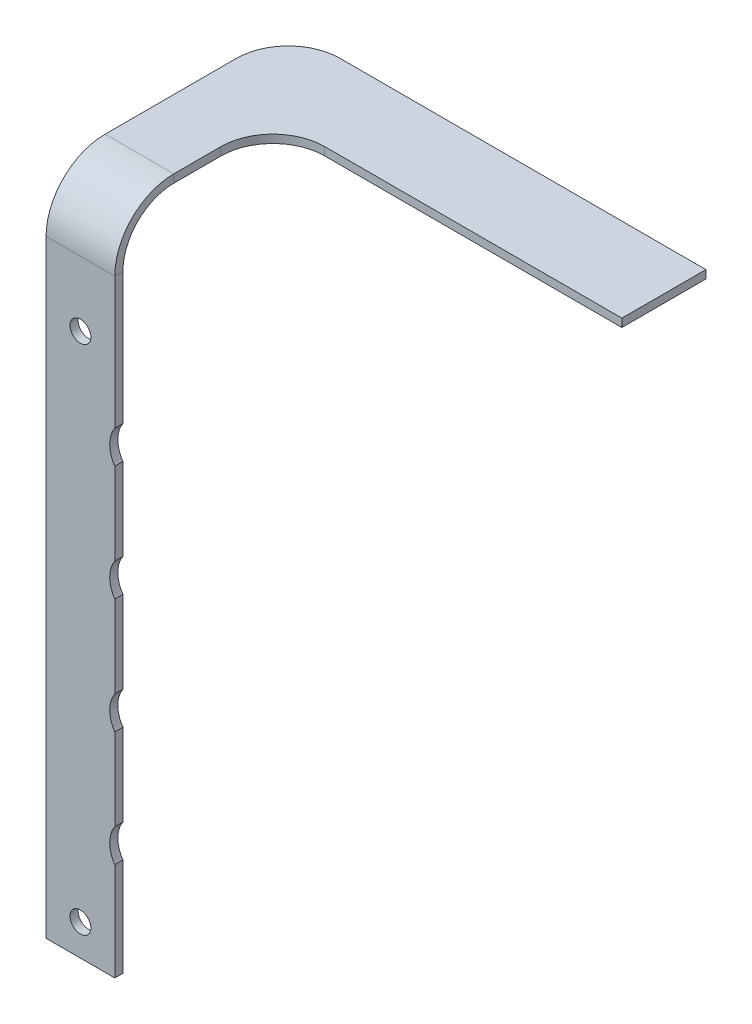
ISO-10303-21;
HEADER;
FILE_DESCRIPTION(('STEP AP214'),'2;1');
FILE_NAME('part.step','',(''),(''),'','','');
FILE_SCHEMA(('AUTOMOTIVE_DESIGN { 1 0 10303 214 1 1 1 1 }'));
ENDSEC;
DATA;
#1=APPLICATION_CONTEXT('core data for automotive mechanical design processes');
#2=APPLICATION_PROTOCOL_DEFINITION('international standard','automotive_design',2000,#1);
#3=PRODUCT_CONTEXT('',#1,'mechanical');
#4=PRODUCT('Part','Part','',(#3));
#5=PRODUCT_RELATED_PRODUCT_CATEGORY('part','',(#4));
#6=PRODUCT_DEFINITION_FORMATION('','',#4);
#7=PRODUCT_DEFINITION_CONTEXT('part definition',#1,'design');
#8=PRODUCT_DEFINITION('design','',#6,#7);
#9=PRODUCT_DEFINITION_SHAPE('','',#8);
#10=(LENGTH_UNIT() NAMED_UNIT(*) SI_UNIT(.MILLI.,.METRE.));
#11=(NAMED_UNIT(*) PLANE_ANGLE_UNIT() SI_UNIT($,.RADIAN.));
#12=(NAMED_UNIT(*) SI_UNIT($,.STERADIAN.) SOLID_ANGLE_UNIT());
#13=UNCERTAINTY_MEASURE_WITH_UNIT(LENGTH_MEASURE(1.E-05),#10,'distance_accuracy_value','');
#14=(GEOMETRIC_REPRESENTATION_CONTEXT(3) GLOBAL_UNCERTAINTY_ASSIGNED_CONTEXT((#13)) GLOBAL_UNIT_ASSIGNED_CONTEXT((#10,
#11,#12)) REPRESENTATION_CONTEXT('',''));
#15=CARTESIAN_POINT('',(0.,0.,0.));
#16=DIRECTION('',(0.,0.,1.));
#17=DIRECTION('',(1.,0.,0.));
#18=AXIS2_PLACEMENT_3D('',#15,#16,#17);
#19=CARTESIAN_POINT('',(-183.376451986279,68.2542114421701,1.5));
#20=DIRECTION('',(-1.,0.,0.));
#21=DIRECTION('',(0.,-1.,0.));
#22=AXIS2_PLACEMENT_3D('',#19,#20,#21);
#23=PLANE('',#22);
#24=DIRECTION('',(0.,1.,0.));
#25=VECTOR('',#24,1.);
#26=CARTESIAN_POINT('',(-183.376451986279,27.5283044221648,-0.100000102));
#27=LINE('',#26,#25);
#28=CARTESIAN_POINT('',(-183.376451986279,56.6542113401701,-0.100000101999995));
#29=VERTEX_POINT('',#28);
#30=CARTESIAN_POINT('',(-183.376451986279,30.7532075774239,-0.100000102));
#31=VERTEX_POINT('',#30);
#32=EDGE_CURVE('E314',#29,#31,#27,.F.);
#33=ORIENTED_EDGE('',*,*,#32,.F.);
#34=DIRECTION('',(0.,0.,1.));
#35=VECTOR('',#34,1.);
#36=CARTESIAN_POINT('',(-183.376451986279,56.6542113401701,-0.100000101999995));
#37=LINE('',#36,#35);
#38=CARTESIAN_POINT('',(-183.376451986279,56.6542113401701,1.5));
#39=VERTEX_POINT('',#38);
#40=EDGE_CURVE('E400',#29,#39,#37,.T.);
#41=ORIENTED_EDGE('',*,*,#40,.T.);
#42=DIRECTION('',(0.,-1.,0.));
#43=VECTOR('',#42,1.);
#44=CARTESIAN_POINT('',(-183.376451986279,68.2542114421701,1.5));
#45=LINE('',#44,#43);
#46=CARTESIAN_POINT('',(-183.376451986279,30.7532075774239,1.5));
#47=VERTEX_POINT('',#46);
#48=EDGE_CURVE('E187',#39,#47,#45,.T.);
#49=ORIENTED_EDGE('',*,*,#48,.T.);
#50=DIRECTION('',(0.,0.,1.));
#51=VECTOR('',#50,1.);
#52=CARTESIAN_POINT('',(-183.376451986279,30.7532075774239,1.5));
#53=LINE('',#52,#51);
#54=EDGE_CURVE('E342',#31,#47,#53,.T.);
#55=ORIENTED_EDGE('',*,*,#54,.F.);
#56=EDGE_LOOP('',(#33,#41,#49,#55));
#57=FACE_BOUND('',#56,.T.);
#58=ADVANCED_FACE('F162',(#57),#23,.F.);
#59=CARTESIAN_POINT('',(-178.676451988279,27.5283044221648,1.5));
#60=DIRECTION('',(0.,0.,1.));
#61=DIRECTION('',(1.,0.,0.));
#62=AXIS2_PLACEMENT_3D('',#59,#60,#61);
#63=PLANE('',#62);
#64=CARTESIAN_POINT('',(-190.126451986279,43.8957045041648,1.5));
#65=DIRECTION('',(0.,0.,1.));
#66=DIRECTION('',(1.,0.,0.));
#67=AXIS2_PLACEMENT_3D('',#64,#65,#66);
#68=CIRCLE('',#67,2.04470000000001);
#69=CARTESIAN_POINT('',(-188.081751986279,43.8957045041648,1.5));
#70=VERTEX_POINT('',#69);
#71=EDGE_CURVE('E341',#70,#70,#68,.T.);
#72=ORIENTED_EDGE('',*,*,#71,.F.);
#73=EDGE_LOOP('',(#72));
#74=FACE_BOUND('',#73,.T.);
#75=CARTESIAN_POINT('',(-190.126451986279,-56.6570956598352,1.5));
#76=DIRECTION('',(0.,0.,1.));
#77=DIRECTION('',(1.,0.,0.));
#78=AXIS2_PLACEMENT_3D('',#75,#76,#77);
#79=CIRCLE('',#78,2.04470000000001);
#80=CARTESIAN_POINT('',(-188.081751986279,-56.6570956598352,1.5));
#81=VERTEX_POINT('',#80);
#82=EDGE_CURVE('E303',#81,#81,#79,.T.);
#83=ORIENTED_EDGE('',*,*,#82,.F.);
#84=EDGE_LOOP('',(#83));
#85=FACE_BOUND('',#84,.T.);
#86=ORIENTED_EDGE('',*,*,#48,.F.);
#87=DIRECTION('',(1.,0.,0.));
#88=VECTOR('',#87,1.);
#89=CARTESIAN_POINT('',(-183.376451986279,56.6542113401701,1.5));
#90=LINE('',#89,#88);
#91=CARTESIAN_POINT('',(-196.876451986279,56.6542113401701,1.5));
#92=VERTEX_POINT('',#91);
#93=EDGE_CURVE('E233',#39,#92,#90,.F.);
#94=ORIENTED_EDGE('',*,*,#93,.T.);
#95=DIRECTION('',(0.,1.,0.));
#96=VECTOR('',#95,1.);
#97=CARTESIAN_POINT('',(-196.876451986279,-62.8005416878299,1.5));
#98=LINE('',#97,#96);
#99=CARTESIAN_POINT('',(-196.876451986279,-62.8005416878299,1.5));
#100=VERTEX_POINT('',#99);
#101=EDGE_CURVE('E389',#100,#92,#98,.T.);
#102=ORIENTED_EDGE('',*,*,#101,.F.);
#103=DIRECTION('',(-1.,0.,0.));
#104=VECTOR('',#103,1.);
#105=CARTESIAN_POINT('',(-183.376451986279,-62.8005416878299,1.5));
#106=LINE('',#105,#104);
#107=CARTESIAN_POINT('',(-183.376451986279,-62.8005416878299,1.5));
#108=VERTEX_POINT('',#107);
#109=EDGE_CURVE('E367',#108,#100,#106,.T.);
#110=ORIENTED_EDGE('',*,*,#109,.F.);
#111=DIRECTION('',(0.,-1.,0.));
#112=VECTOR('',#111,1.);
#113=CARTESIAN_POINT('',(-183.376451986279,-43.5145986765344,1.5));
#114=LINE('',#113,#112);
#115=CARTESIAN_POINT('',(-183.376451986279,-43.5145986765344,1.5));
#116=VERTEX_POINT('',#115);
#117=EDGE_CURVE('E357',#116,#108,#114,.T.);
#118=ORIENTED_EDGE('',*,*,#117,.F.);
#119=CARTESIAN_POINT('',(-178.676451988279,-40.2896955778352,1.5));
#120=DIRECTION('',(0.,0.,1.));
#121=DIRECTION('',(1.,0.,0.));
#122=AXIS2_PLACEMENT_3D('',#119,#120,#121);
#123=CIRCLE('',#122,5.699999998);
#124=CARTESIAN_POINT('',(-183.376451986279,-37.0647924791359,1.5));
#125=VERTEX_POINT('',#124);
#126=EDGE_CURVE('E364',#125,#116,#123,.T.);
#127=ORIENTED_EDGE('',*,*,#126,.F.);
#128=DIRECTION('',(0.,-1.,0.));
#129=VECTOR('',#128,1.);
#130=CARTESIAN_POINT('',(-183.376451986279,-20.9085986765344,1.5));
#131=LINE('',#130,#129);
#132=CARTESIAN_POINT('',(-183.376451986279,-20.9085986765344,1.5));
#133=VERTEX_POINT('',#132);
#134=EDGE_CURVE('E370',#133,#125,#131,.T.);
#135=ORIENTED_EDGE('',*,*,#134,.F.);
#136=CARTESIAN_POINT('',(-178.676451988279,-17.6836955778352,1.5));
#137=DIRECTION('',(0.,0.,1.));
#138=DIRECTION('',(1.,0.,0.));
#139=AXIS2_PLACEMENT_3D('',#136,#137,#138);
#140=CIRCLE('',#139,5.69999999800001);
#141=CARTESIAN_POINT('',(-183.376451986279,-14.4587924791359,1.5));
#142=VERTEX_POINT('',#141);
#143=EDGE_CURVE('E372',#142,#133,#140,.T.);
#144=ORIENTED_EDGE('',*,*,#143,.F.);
#145=DIRECTION('',(0.,-1.,0.));
#146=VECTOR('',#145,1.);
#147=CARTESIAN_POINT('',(-183.376451986279,1.69740132346556,1.5));
#148=LINE('',#147,#146);
#149=CARTESIAN_POINT('',(-183.376451986279,1.69740132346556,1.5));
#150=VERTEX_POINT('',#149);
#151=EDGE_CURVE('E294',#150,#142,#148,.T.);
#152=ORIENTED_EDGE('',*,*,#151,.F.);
#153=CARTESIAN_POINT('',(-178.676451988279,4.92230442216482,1.5));
#154=DIRECTION('',(0.,0.,1.));
#155=DIRECTION('',(1.,0.,0.));
#156=AXIS2_PLACEMENT_3D('',#153,#154,#155);
#157=CIRCLE('',#156,5.69999999800001);
#158=CARTESIAN_POINT('',(-183.376451986279,8.14720752086408,1.5));
#159=VERTEX_POINT('',#158);
#160=EDGE_CURVE('E275',#159,#150,#157,.T.);
#161=ORIENTED_EDGE('',*,*,#160,.F.);
#162=DIRECTION('',(0.,-1.,0.));
#163=VECTOR('',#162,1.);
#164=CARTESIAN_POINT('',(-183.376451986279,24.3034012669057,1.5));
#165=LINE('',#164,#163);
#166=CARTESIAN_POINT('',(-183.376451986279,24.3034012669057,1.5));
#167=VERTEX_POINT('',#166);
#168=EDGE_CURVE('E290',#167,#159,#165,.T.);
#169=ORIENTED_EDGE('',*,*,#168,.F.);
#170=CARTESIAN_POINT('',(-178.676451988279,27.5283044221648,1.5));
#171=DIRECTION('',(0.,0.,1.));
#172=DIRECTION('',(1.,0.,0.));
#173=AXIS2_PLACEMENT_3D('',#170,#171,#172);
#174=CIRCLE('',#173,5.70000003000002);
#175=EDGE_CURVE('E297',#47,#167,#174,.T.);
#176=ORIENTED_EDGE('',*,*,#175,.F.);
#177=EDGE_LOOP('',(#86,#94,#102,#110,#118,#127,#135,#144,#152,#161,#169,#176));
#178=FACE_BOUND('',#177,.T.);
#179=ADVANCED_FACE('F288',(#74,#85,#178),#63,.T.);
#180=CARTESIAN_POINT('',(-178.676451988279,27.5283044221648,-0.100000102));
#181=DIRECTION('',(0.,0.,1.));
#182=DIRECTION('',(1.,0.,0.));
#183=AXIS2_PLACEMENT_3D('',#180,#181,#182);
#184=PLANE('',#183);
#185=CARTESIAN_POINT('',(-190.126451986279,-56.6570956598352,-0.100000102));
#186=DIRECTION('',(0.,0.,1.));
#187=DIRECTION('',(1.,0.,0.));
#188=AXIS2_PLACEMENT_3D('',#185,#186,#187);
#189=CIRCLE('',#188,2.04470000000001);
#190=CARTESIAN_POINT('',(-188.081751986279,-56.6570956598352,-0.100000102));
#191=VERTEX_POINT('',#190);
#192=EDGE_CURVE('E316',#191,#191,#189,.T.);
#193=ORIENTED_EDGE('',*,*,#192,.T.);
#194=EDGE_LOOP('',(#193));
#195=FACE_BOUND('',#194,.T.);
#196=CARTESIAN_POINT('',(-190.126451986279,43.8957045041648,-0.100000102));
#197=DIRECTION('',(0.,0.,1.));
#198=DIRECTION('',(1.,0.,0.));
#199=AXIS2_PLACEMENT_3D('',#196,#197,#198);
#200=CIRCLE('',#199,2.04470000000001);
#201=CARTESIAN_POINT('',(-188.081751986279,43.8957045041648,-0.100000102));
#202=VERTEX_POINT('',#201);
#203=EDGE_CURVE('E306',#202,#202,#200,.T.);
#204=ORIENTED_EDGE('',*,*,#203,.T.);
#205=EDGE_LOOP('',(#204));
#206=FACE_BOUND('',#205,.T.);
#207=DIRECTION('',(1.,0.,0.));
#208=VECTOR('',#207,1.);
#209=CARTESIAN_POINT('',(-183.376451986279,56.6542113401701,-0.100000101999995));
#210=LINE('',#209,#208);
#211=CARTESIAN_POINT('',(-196.876451986279,56.6542113401701,-0.100000101999995));
#212=VERTEX_POINT('',#211);
#213=EDGE_CURVE('E406',#29,#212,#210,.F.);
#214=ORIENTED_EDGE('',*,*,#213,.F.);
#215=ORIENTED_EDGE('',*,*,#32,.T.);
#216=CARTESIAN_POINT('',(-178.676451988279,27.5283044221648,-0.100000102));
#217=DIRECTION('',(0.,0.,1.));
#218=DIRECTION('',(1.,0.,0.));
#219=AXIS2_PLACEMENT_3D('',#216,#217,#218);
#220=CIRCLE('',#219,5.70000003000002);
#221=CARTESIAN_POINT('',(-183.376451986279,24.3034012669057,-0.100000102));
#222=VERTEX_POINT('',#221);
#223=EDGE_CURVE('E317',#31,#222,#220,.T.);
#224=ORIENTED_EDGE('',*,*,#223,.T.);
#225=DIRECTION('',(0.,1.,0.));
#226=VECTOR('',#225,1.);
#227=CARTESIAN_POINT('',(-183.376451986279,27.5283044221648,-0.100000102));
#228=LINE('',#227,#226);
#229=CARTESIAN_POINT('',(-183.376451986279,8.14720752086408,-0.100000102));
#230=VERTEX_POINT('',#229);
#231=EDGE_CURVE('E320',#222,#230,#228,.F.);
#232=ORIENTED_EDGE('',*,*,#231,.T.);
#233=CARTESIAN_POINT('',(-178.676451988279,4.92230442216482,-0.100000102));
#234=DIRECTION('',(0.,0.,1.));
#235=DIRECTION('',(1.,0.,0.));
#236=AXIS2_PLACEMENT_3D('',#233,#234,#235);
#237=CIRCLE('',#236,5.69999999800001);
#238=CARTESIAN_POINT('',(-183.376451986279,1.69740132346556,-0.100000102));
#239=VERTEX_POINT('',#238);
#240=EDGE_CURVE('E277',#230,#239,#237,.T.);
#241=ORIENTED_EDGE('',*,*,#240,.T.);
#242=DIRECTION('',(0.,1.,0.));
#243=VECTOR('',#242,1.);
#244=CARTESIAN_POINT('',(-183.376451986279,27.5283044221648,-0.100000102));
#245=LINE('',#244,#243);
#246=CARTESIAN_POINT('',(-183.376451986279,-14.4587924791359,-0.100000102));
#247=VERTEX_POINT('',#246);
#248=EDGE_CURVE('E323',#239,#247,#245,.F.);
#249=ORIENTED_EDGE('',*,*,#248,.T.);
#250=CARTESIAN_POINT('',(-178.676451988279,-17.6836955778352,-0.100000102));
#251=DIRECTION('',(0.,0.,1.));
#252=DIRECTION('',(1.,0.,0.));
#253=AXIS2_PLACEMENT_3D('',#250,#251,#252);
#254=CIRCLE('',#253,5.69999999800001);
#255=CARTESIAN_POINT('',(-183.376451986279,-20.9085986765344,-0.100000102));
#256=VERTEX_POINT('',#255);
#257=EDGE_CURVE('E326',#247,#256,#254,.T.);
#258=ORIENTED_EDGE('',*,*,#257,.T.);
#259=DIRECTION('',(0.,1.,0.));
#260=VECTOR('',#259,1.);
#261=CARTESIAN_POINT('',(-183.376451986279,27.5283044221648,-0.100000102));
#262=LINE('',#261,#260);
#263=CARTESIAN_POINT('',(-183.376451986279,-37.0647924791359,-0.100000102));
#264=VERTEX_POINT('',#263);
#265=EDGE_CURVE('E329',#256,#264,#262,.F.);
#266=ORIENTED_EDGE('',*,*,#265,.T.);
#267=CARTESIAN_POINT('',(-178.676451988279,-40.2896955778352,-0.100000102));
#268=DIRECTION('',(0.,0.,1.));
#269=DIRECTION('',(1.,0.,0.));
#270=AXIS2_PLACEMENT_3D('',#267,#268,#269);
#271=CIRCLE('',#270,5.699999998);
#272=CARTESIAN_POINT('',(-183.376451986279,-43.5145986765344,-0.100000102));
#273=VERTEX_POINT('',#272);
#274=EDGE_CURVE('E332',#264,#273,#271,.T.);
#275=ORIENTED_EDGE('',*,*,#274,.T.);
#276=DIRECTION('',(0.,1.,0.));
#277=VECTOR('',#276,1.);
#278=CARTESIAN_POINT('',(-183.376451986279,27.5283044221648,-0.100000102));
#279=LINE('',#278,#277);
#280=CARTESIAN_POINT('',(-183.376451986279,-62.8005416878299,-0.100000102));
#281=VERTEX_POINT('',#280);
#282=EDGE_CURVE('E335',#273,#281,#279,.F.);
#283=ORIENTED_EDGE('',*,*,#282,.T.);
#284=DIRECTION('',(1.,0.,0.));
#285=VECTOR('',#284,1.);
#286=CARTESIAN_POINT('',(-178.676451988279,-62.8005416878299,-0.100000102));
#287=LINE('',#286,#285);
#288=CARTESIAN_POINT('',(-196.876451986279,-62.8005416878299,-0.100000102));
#289=VERTEX_POINT('',#288);
#290=EDGE_CURVE('E313',#281,#289,#287,.F.);
#291=ORIENTED_EDGE('',*,*,#290,.T.);
#292=DIRECTION('',(0.,1.,0.));
#293=VECTOR('',#292,1.);
#294=CARTESIAN_POINT('',(-196.876451986279,27.5283044221648,-0.100000102));
#295=LINE('',#294,#293);
#296=EDGE_CURVE('E309',#289,#212,#295,.T.);
#297=ORIENTED_EDGE('',*,*,#296,.T.);
#298=EDGE_LOOP('',(#214,#215,#224,#232,#241,#249,#258,#266,#275,#283,#291,#297));
#299=FACE_BOUND('',#298,.T.);
#300=ADVANCED_FACE('F382',(#195,#206,#299),#184,.F.);
#301=CARTESIAN_POINT('',(-183.376451986279,-43.5145986765344,1.5));
#302=DIRECTION('',(-1.,0.,0.));
#303=DIRECTION('',(0.,-1.,0.));
#304=AXIS2_PLACEMENT_3D('',#301,#302,#303);
#305=PLANE('',#304);
#306=DIRECTION('',(0.,0.,1.));
#307=VECTOR('',#306,1.);
#308=CARTESIAN_POINT('',(-183.376451986279,-62.8005416878299,1.5));
#309=LINE('',#308,#307);
#310=EDGE_CURVE('E13',#281,#108,#309,.T.);
#311=ORIENTED_EDGE('',*,*,#310,.F.);
#312=ORIENTED_EDGE('',*,*,#282,.F.);
#313=DIRECTION('',(0.,0.,1.));
#314=VECTOR('',#313,1.);
#315=CARTESIAN_POINT('',(-183.376451986279,-43.5145986765344,1.5));
#316=LINE('',#315,#314);
#317=EDGE_CURVE('E171',#273,#116,#316,.T.);
#318=ORIENTED_EDGE('',*,*,#317,.T.);
#319=ORIENTED_EDGE('',*,*,#117,.T.);
#320=EDGE_LOOP('',(#311,#312,#318,#319));
#321=FACE_BOUND('',#320,.T.);
#322=ADVANCED_FACE('F356',(#321),#305,.F.);
#323=CARTESIAN_POINT('',(-178.676451988279,-40.2896955778352,1.5));
#324=DIRECTION('',(0.,0.,1.));
#325=DIRECTION('',(1.,0.,0.));
#326=AXIS2_PLACEMENT_3D('',#323,#324,#325);
#327=CYLINDRICAL_SURFACE('',#326,5.699999998);
#328=ORIENTED_EDGE('',*,*,#317,.F.);
#329=ORIENTED_EDGE('',*,*,#274,.F.);
#330=DIRECTION('',(0.,0.,1.));
#331=VECTOR('',#330,1.);
#332=CARTESIAN_POINT('',(-183.376451986279,-37.0647924791359,1.5));
#333=LINE('',#332,#331);
#334=EDGE_CURVE('E350',#264,#125,#333,.T.);
#335=ORIENTED_EDGE('',*,*,#334,.T.);
#336=ORIENTED_EDGE('',*,*,#126,.T.);
#337=EDGE_LOOP('',(#328,#329,#335,#336));
#338=FACE_BOUND('',#337,.T.);
#339=ADVANCED_FACE('F369',(#338),#327,.F.);
#340=CARTESIAN_POINT('',(-183.376451986279,-20.9085986765344,1.5));
#341=DIRECTION('',(-1.,0.,0.));
#342=DIRECTION('',(0.,-1.,0.));
#343=AXIS2_PLACEMENT_3D('',#340,#341,#342);
#344=PLANE('',#343);
#345=ORIENTED_EDGE('',*,*,#334,.F.);
#346=ORIENTED_EDGE('',*,*,#265,.F.);
#347=DIRECTION('',(0.,0.,1.));
#348=VECTOR('',#347,1.);
#349=CARTESIAN_POINT('',(-183.376451986279,-20.9085986765344,1.5));
#350=LINE('',#349,#348);
#351=EDGE_CURVE('E348',#256,#133,#350,.T.);
#352=ORIENTED_EDGE('',*,*,#351,.T.);
#353=ORIENTED_EDGE('',*,*,#134,.T.);
#354=EDGE_LOOP('',(#345,#346,#352,#353));
#355=FACE_BOUND('',#354,.T.);
#356=ADVANCED_FACE('F581',(#355),#344,.F.);
#357=CARTESIAN_POINT('',(-178.676451988279,-17.6836955778352,1.5));
#358=DIRECTION('',(0.,0.,1.));
#359=DIRECTION('',(1.,0.,0.));
#360=AXIS2_PLACEMENT_3D('',#357,#358,#359);
#361=CYLINDRICAL_SURFACE('',#360,5.69999999800001);
#362=ORIENTED_EDGE('',*,*,#351,.F.);
#363=ORIENTED_EDGE('',*,*,#257,.F.);
#364=DIRECTION('',(0.,0.,1.));
#365=VECTOR('',#364,1.);
#366=CARTESIAN_POINT('',(-183.376451986279,-14.4587924791359,1.5));
#367=LINE('',#366,#365);
#368=EDGE_CURVE('E346',#247,#142,#367,.T.);
#369=ORIENTED_EDGE('',*,*,#368,.T.);
#370=ORIENTED_EDGE('',*,*,#143,.T.);
#371=EDGE_LOOP('',(#362,#363,#369,#370));
#372=FACE_BOUND('',#371,.T.);
#373=ADVANCED_FACE('F578',(#372),#361,.F.);
#374=CARTESIAN_POINT('',(-183.376451986279,1.69740132346556,1.5));
#375=DIRECTION('',(-1.,0.,0.));
#376=DIRECTION('',(0.,-1.,0.));
#377=AXIS2_PLACEMENT_3D('',#374,#375,#376);
#378=PLANE('',#377);
#379=ORIENTED_EDGE('',*,*,#368,.F.);
#380=ORIENTED_EDGE('',*,*,#248,.F.);
#381=DIRECTION('',(0.,0.,1.));
#382=VECTOR('',#381,1.);
#383=CARTESIAN_POINT('',(-183.376451986279,1.69740132346556,1.5));
#384=LINE('',#383,#382);
#385=EDGE_CURVE('E282',#239,#150,#384,.T.);
#386=ORIENTED_EDGE('',*,*,#385,.T.);
#387=ORIENTED_EDGE('',*,*,#151,.T.);
#388=EDGE_LOOP('',(#379,#380,#386,#387));
#389=FACE_BOUND('',#388,.T.);
#390=ADVANCED_FACE('F378',(#389),#378,.F.);
#391=CARTESIAN_POINT('',(-178.676451988279,4.92230442216482,1.5));
#392=DIRECTION('',(0.,0.,1.));
#393=DIRECTION('',(1.,0.,0.));
#394=AXIS2_PLACEMENT_3D('',#391,#392,#393);
#395=CYLINDRICAL_SURFACE('',#394,5.69999999800001);
#396=ORIENTED_EDGE('',*,*,#385,.F.);
#397=ORIENTED_EDGE('',*,*,#240,.F.);
#398=DIRECTION('',(0.,0.,1.));
#399=VECTOR('',#398,1.);
#400=CARTESIAN_POINT('',(-183.376451986279,8.14720752086408,1.5));
#401=LINE('',#400,#399);
#402=EDGE_CURVE('E272',#230,#159,#401,.T.);
#403=ORIENTED_EDGE('',*,*,#402,.T.);
#404=ORIENTED_EDGE('',*,*,#160,.T.);
#405=EDGE_LOOP('',(#396,#397,#403,#404));
#406=FACE_BOUND('',#405,.T.);
#407=ADVANCED_FACE('F274',(#406),#395,.F.);
#408=CARTESIAN_POINT('',(-183.376451986279,24.3034012669057,1.5));
#409=DIRECTION('',(-1.,0.,0.));
#410=DIRECTION('',(0.,-1.,0.));
#411=AXIS2_PLACEMENT_3D('',#408,#409,#410);
#412=PLANE('',#411);
#413=ORIENTED_EDGE('',*,*,#402,.F.);
#414=ORIENTED_EDGE('',*,*,#231,.F.);
#415=DIRECTION('',(0.,0.,1.));
#416=VECTOR('',#415,1.);
#417=CARTESIAN_POINT('',(-183.376451986279,24.3034012669057,1.5));
#418=LINE('',#417,#416);
#419=EDGE_CURVE('E283',#222,#167,#418,.T.);
#420=ORIENTED_EDGE('',*,*,#419,.T.);
#421=ORIENTED_EDGE('',*,*,#168,.T.);
#422=EDGE_LOOP('',(#413,#414,#420,#421));
#423=FACE_BOUND('',#422,.T.);
#424=ADVANCED_FACE('F296',(#423),#412,.F.);
#425=CARTESIAN_POINT('',(-178.676451988279,27.5283044221648,1.5));
#426=DIRECTION('',(0.,0.,1.));
#427=DIRECTION('',(1.,0.,0.));
#428=AXIS2_PLACEMENT_3D('',#425,#426,#427);
#429=CYLINDRICAL_SURFACE('',#428,5.70000003000002);
#430=ORIENTED_EDGE('',*,*,#419,.F.);
#431=ORIENTED_EDGE('',*,*,#223,.F.);
#432=ORIENTED_EDGE('',*,*,#54,.T.);
#433=ORIENTED_EDGE('',*,*,#175,.T.);
#434=EDGE_LOOP('',(#430,#431,#432,#433));
#435=FACE_BOUND('',#434,.T.);
#436=ADVANCED_FACE('F387',(#435),#429,.F.);
#437=CARTESIAN_POINT('',(-196.876451986279,-62.8005416878299,1.5));
#438=DIRECTION('',(1.,0.,0.));
#439=DIRECTION('',(0.,1.,0.));
#440=AXIS2_PLACEMENT_3D('',#437,#438,#439);
#441=PLANE('',#440);
#442=DIRECTION('',(0.,0.,1.));
#443=VECTOR('',#442,1.);
#444=CARTESIAN_POINT('',(-196.876451986279,56.6542113401701,-0.100000101999995));
#445=LINE('',#444,#443);
#446=EDGE_CURVE('E310',#212,#92,#445,.T.);
#447=ORIENTED_EDGE('',*,*,#446,.F.);
#448=ORIENTED_EDGE('',*,*,#296,.F.);
#449=DIRECTION('',(0.,0.,1.));
#450=VECTOR('',#449,1.);
#451=CARTESIAN_POINT('',(-196.876451986279,-62.8005416878299,1.5));
#452=LINE('',#451,#450);
#453=EDGE_CURVE('E166',#289,#100,#452,.T.);
#454=ORIENTED_EDGE('',*,*,#453,.T.);
#455=ORIENTED_EDGE('',*,*,#101,.T.);
#456=EDGE_LOOP('',(#447,#448,#454,#455));
#457=FACE_BOUND('',#456,.T.);
#458=ADVANCED_FACE('F394',(#457),#441,.F.);
#459=CARTESIAN_POINT('',(-190.126451986279,43.8957045041648,1.5));
#460=DIRECTION('',(0.,0.,1.));
#461=DIRECTION('',(1.,0.,0.));
#462=AXIS2_PLACEMENT_3D('',#459,#460,#461);
#463=CYLINDRICAL_SURFACE('',#462,2.04470000000001);
#464=ORIENTED_EDGE('',*,*,#71,.T.);
#465=EDGE_LOOP('',(#464));
#466=FACE_BOUND('',#465,.T.);
#467=ORIENTED_EDGE('',*,*,#203,.F.);
#468=EDGE_LOOP('',(#467));
#469=FACE_BOUND('',#468,.T.);
#470=ADVANCED_FACE('F591',(#466,#469),#463,.F.);
#471=CARTESIAN_POINT('',(-183.376451986279,-62.8005416878299,1.5));
#472=DIRECTION('',(0.,1.,0.));
#473=DIRECTION('',(-1.,0.,0.));
#474=AXIS2_PLACEMENT_3D('',#471,#472,#473);
#475=PLANE('',#474);
#476=ORIENTED_EDGE('',*,*,#290,.F.);
#477=ORIENTED_EDGE('',*,*,#310,.T.);
#478=ORIENTED_EDGE('',*,*,#109,.T.);
#479=ORIENTED_EDGE('',*,*,#453,.F.);
#480=EDGE_LOOP('',(#476,#477,#478,#479));
#481=FACE_BOUND('',#480,.T.);
#482=ADVANCED_FACE('F589',(#481),#475,.F.);
#483=CARTESIAN_POINT('',(-190.126451986279,-56.6570956598352,1.5));
#484=DIRECTION('',(0.,0.,1.));
#485=DIRECTION('',(1.,0.,0.));
#486=AXIS2_PLACEMENT_3D('',#483,#484,#485);
#487=CYLINDRICAL_SURFACE('',#486,2.04470000000001);
#488=ORIENTED_EDGE('',*,*,#82,.T.);
#489=EDGE_LOOP('',(#488));
#490=FACE_BOUND('',#489,.T.);
#491=ORIENTED_EDGE('',*,*,#192,.F.);
#492=EDGE_LOOP('',(#491));
#493=FACE_BOUND('',#492,.T.);
#494=ADVANCED_FACE('F164',(#490,#493),#487,.F.);
#495=CARTESIAN_POINT('',(-196.876451986279,56.6542113401701,-10.100000102));
#496=DIRECTION('',(-1.,0.,0.));
#497=DIRECTION('',(0.,0.,1.));
#498=AXIS2_PLACEMENT_3D('',#495,#496,#497);
#499=PLANE('',#498);
#500=DIRECTION('',(0.,-1.,0.));
#501=VECTOR('',#500,1.);
#502=CARTESIAN_POINT('',(-196.876451986279,68.2542114421701,-10.100000102));
#503=LINE('',#502,#501);
#504=CARTESIAN_POINT('',(-196.876451986279,66.6542113401701,-10.100000102));
#505=VERTEX_POINT('',#504);
#506=CARTESIAN_POINT('',(-196.876451986279,68.2542114421701,-10.100000102));
#507=VERTEX_POINT('',#506);
#508=EDGE_CURVE('E414',#505,#507,#503,.F.);
#509=ORIENTED_EDGE('',*,*,#508,.F.);
#510=CARTESIAN_POINT('',(-196.876451986279,56.6542113401701,-10.100000102));
#511=DIRECTION('',(1.,0.,0.));
#512=DIRECTION('',(0.,0.,-1.));
#513=AXIS2_PLACEMENT_3D('',#510,#511,#512);
#514=CIRCLE('',#513,10.);
#515=EDGE_CURVE('E409',#212,#505,#514,.F.);
#516=ORIENTED_EDGE('',*,*,#515,.F.);
#517=ORIENTED_EDGE('',*,*,#446,.T.);
#518=CARTESIAN_POINT('',(-196.876451986279,56.6542113401701,-10.100000102));
#519=DIRECTION('',(1.,0.,0.));
#520=DIRECTION('',(0.,0.,-1.));
#521=AXIS2_PLACEMENT_3D('',#518,#519,#520);
#522=CIRCLE('',#521,11.600000102);
#523=EDGE_CURVE('E178',#92,#507,#522,.F.);
#524=ORIENTED_EDGE('',*,*,#523,.T.);
#525=EDGE_LOOP('',(#509,#516,#517,#524));
#526=FACE_BOUND('',#525,.T.);
#527=ADVANCED_FACE('F596',(#526),#499,.T.);
#528=CARTESIAN_POINT('',(-183.376451986279,56.6542113401701,-10.100000102));
#529=DIRECTION('',(-1.,0.,0.));
#530=DIRECTION('',(0.,0.,1.));
#531=AXIS2_PLACEMENT_3D('',#528,#529,#530);
#532=PLANE('',#531);
#533=CARTESIAN_POINT('',(-183.376451986279,56.6542113401701,-10.100000102));
#534=DIRECTION('',(1.,0.,0.));
#535=DIRECTION('',(0.,0.,-1.));
#536=AXIS2_PLACEMENT_3D('',#533,#534,#535);
#537=CIRCLE('',#536,10.);
#538=CARTESIAN_POINT('',(-183.376451986279,66.6542113401701,-10.100000102));
#539=VERTEX_POINT('',#538);
#540=EDGE_CURVE('E403',#539,#29,#537,.T.);
#541=ORIENTED_EDGE('',*,*,#540,.F.);
#542=DIRECTION('',(0.,-1.,0.));
#543=VECTOR('',#542,1.);
#544=CARTESIAN_POINT('',(-183.376451986279,66.6542113401701,-10.100000102));
#545=LINE('',#544,#543);
#546=CARTESIAN_POINT('',(-183.376451986279,68.2542114421701,-10.100000102));
#547=VERTEX_POINT('',#546);
#548=EDGE_CURVE('E419',#539,#547,#545,.F.);
#549=ORIENTED_EDGE('',*,*,#548,.T.);
#550=CARTESIAN_POINT('',(-183.376451986279,56.6542113401701,-10.100000102));
#551=DIRECTION('',(1.,0.,0.));
#552=DIRECTION('',(0.,0.,-1.));
#553=AXIS2_PLACEMENT_3D('',#550,#551,#552);
#554=CIRCLE('',#553,11.600000102);
#555=EDGE_CURVE('E390',#547,#39,#554,.T.);
#556=ORIENTED_EDGE('',*,*,#555,.T.);
#557=ORIENTED_EDGE('',*,*,#40,.F.);
#558=EDGE_LOOP('',(#541,#549,#556,#557));
#559=FACE_BOUND('',#558,.T.);
#560=ADVANCED_FACE('F506',(#559),#532,.F.);
#561=CARTESIAN_POINT('',(-183.376451986279,56.6542113401701,-10.100000102));
#562=DIRECTION('',(1.,0.,0.));
#563=DIRECTION('',(0.,1.,0.));
#564=AXIS2_PLACEMENT_3D('',#561,#562,#563);
#565=CYLINDRICAL_SURFACE('',#564,11.600000102);
#566=ORIENTED_EDGE('',*,*,#93,.F.);
#567=ORIENTED_EDGE('',*,*,#555,.F.);
#568=DIRECTION('',(1.,0.,0.));
#569=VECTOR('',#568,1.);
#570=CARTESIAN_POINT('',(-196.876451986279,68.2542114421701,-10.100000102));
#571=LINE('',#570,#569);
#572=EDGE_CURVE('E422',#547,#507,#571,.F.);
#573=ORIENTED_EDGE('',*,*,#572,.T.);
#574=ORIENTED_EDGE('',*,*,#523,.F.);
#575=EDGE_LOOP('',(#566,#567,#573,#574));
#576=FACE_BOUND('',#575,.T.);
#577=ADVANCED_FACE('F606',(#576),#565,.T.);
#578=CARTESIAN_POINT('',(-183.376451986279,56.6542113401701,-10.100000102));
#579=DIRECTION('',(1.,0.,0.));
#580=DIRECTION('',(0.,1.,0.));
#581=AXIS2_PLACEMENT_3D('',#578,#579,#580);
#582=CYLINDRICAL_SURFACE('',#581,10.);
#583=ORIENTED_EDGE('',*,*,#213,.T.);
#584=ORIENTED_EDGE('',*,*,#515,.T.);
#585=DIRECTION('',(1.,0.,0.));
#586=VECTOR('',#585,1.);
#587=CARTESIAN_POINT('',(-196.876451986279,66.6542113401701,-10.100000102));
#588=LINE('',#587,#586);
#589=EDGE_CURVE('E417',#505,#539,#588,.T.);
#590=ORIENTED_EDGE('',*,*,#589,.T.);
#591=ORIENTED_EDGE('',*,*,#540,.T.);
#592=EDGE_LOOP('',(#583,#584,#590,#591));
#593=FACE_BOUND('',#592,.T.);
#594=ADVANCED_FACE('F502',(#593),#582,.F.);
#595=CARTESIAN_POINT('',(-183.376451986279,68.2542114421702,-19.4057024826195));
#596=DIRECTION('',(-1.,0.,0.));
#597=DIRECTION('',(0.,0.,1.));
#598=AXIS2_PLACEMENT_3D('',#595,#596,#597);
#599=PLANE('',#598);
#600=ORIENTED_EDGE('',*,*,#548,.F.);
#601=DIRECTION('',(0.,0.,1.));
#602=VECTOR('',#601,1.);
#603=CARTESIAN_POINT('',(-183.376451986279,66.6542113401702,-19.4057024826195));
#604=LINE('',#603,#602);
#605=CARTESIAN_POINT('',(-183.376451986279,66.6542113401702,-19.4057024826195));
#606=VERTEX_POINT('',#605);
#607=EDGE_CURVE('E424',#539,#606,#604,.F.);
#608=ORIENTED_EDGE('',*,*,#607,.T.);
#609=DIRECTION('',(0.,-1.,0.));
#610=VECTOR('',#609,1.);
#611=CARTESIAN_POINT('',(-183.376451986279,68.2542114421702,-19.4057024826195));
#612=LINE('',#611,#610);
#613=CARTESIAN_POINT('',(-183.376451986279,68.2542114421702,-19.4057024826195));
#614=VERTEX_POINT('',#613);
#615=EDGE_CURVE('E407',#614,#606,#612,.T.);
#616=ORIENTED_EDGE('',*,*,#615,.F.);
#617=DIRECTION('',(0.,0.,-1.));
#618=VECTOR('',#617,1.);
#619=CARTESIAN_POINT('',(-183.376451986279,68.2542114421702,-19.4057024826195));
#620=LINE('',#619,#618);
#621=EDGE_CURVE('E445',#547,#614,#620,.T.);
#622=ORIENTED_EDGE('',*,*,#621,.F.);
#623=EDGE_LOOP('',(#600,#608,#616,#622));
#624=FACE_BOUND('',#623,.T.);
#625=ADVANCED_FACE('F511',(#624),#599,.F.);
#626=CARTESIAN_POINT('',(-196.876451986279,68.2542114421701,-0.100000101999994));
#627=DIRECTION('',(1.,0.,0.));
#628=DIRECTION('',(0.,0.,-1.));
#629=AXIS2_PLACEMENT_3D('',#626,#627,#628);
#630=PLANE('',#629);
#631=ORIENTED_EDGE('',*,*,#508,.T.);
#632=DIRECTION('',(0.,0.,1.));
#633=VECTOR('',#632,1.);
#634=CARTESIAN_POINT('',(-196.876451986279,68.2542114421702,-19.4057024826195));
#635=LINE('',#634,#633);
#636=CARTESIAN_POINT('',(-196.876451986279,68.2542114421702,-35.9233203693963));
#637=VERTEX_POINT('',#636);
#638=EDGE_CURVE('E463',#637,#507,#635,.T.);
#639=ORIENTED_EDGE('',*,*,#638,.F.);
#640=DIRECTION('',(0.,-1.,0.));
#641=VECTOR('',#640,1.);
#642=CARTESIAN_POINT('',(-196.876451986279,68.2542114421702,-35.9233203693963));
#643=LINE('',#642,#641);
#644=CARTESIAN_POINT('',(-196.876451986279,66.6542113401702,-35.9233203693963));
#645=VERTEX_POINT('',#644);
#646=EDGE_CURVE('E466',#637,#645,#643,.T.);
#647=ORIENTED_EDGE('',*,*,#646,.T.);
#648=DIRECTION('',(0.,0.,-1.));
#649=VECTOR('',#648,1.);
#650=CARTESIAN_POINT('',(-196.876451986279,66.6542113401701,-0.100000102));
#651=LINE('',#650,#649);
#652=EDGE_CURVE('E442',#645,#505,#651,.F.);
#653=ORIENTED_EDGE('',*,*,#652,.T.);
#654=EDGE_LOOP('',(#631,#639,#647,#653));
#655=FACE_BOUND('',#654,.T.);
#656=ADVANCED_FACE('F487',(#655),#630,.F.);
#657=CARTESIAN_POINT('',(-173.216451986279,68.2542114421702,-19.4057024826195));
#658=DIRECTION('',(0.,-1.,0.));
#659=DIRECTION('',(0.,0.,-1.));
#660=AXIS2_PLACEMENT_3D('',#657,#658,#659);
#661=PLANE('',#660);
#662=ORIENTED_EDGE('',*,*,#572,.F.);
#663=ORIENTED_EDGE('',*,*,#621,.T.);
#664=CARTESIAN_POINT('',(-173.216451986279,68.2542114421702,-19.4057024826195));
#665=DIRECTION('',(0.,-1.,0.));
#666=DIRECTION('',(0.,0.,-1.));
#667=AXIS2_PLACEMENT_3D('',#664,#665,#666);
#668=CIRCLE('',#667,10.16);
#669=CARTESIAN_POINT('',(-173.216451986279,68.2542114421702,-29.5657024826195));
#670=VERTEX_POINT('',#669);
#671=EDGE_CURVE('E448',#614,#670,#668,.T.);
#672=ORIENTED_EDGE('',*,*,#671,.T.);
#673=DIRECTION('',(1.,0.,0.));
#674=VECTOR('',#673,1.);
#675=CARTESIAN_POINT('',(-173.216451986279,68.2542114421702,-29.5657024826195));
#676=LINE('',#675,#674);
#677=CARTESIAN_POINT('',(-114.796451986279,68.2542114421702,-29.5657024826195));
#678=VERTEX_POINT('',#677);
#679=EDGE_CURVE('E451',#670,#678,#676,.T.);
#680=ORIENTED_EDGE('',*,*,#679,.T.);
#681=DIRECTION('',(0.,0.,-1.));
#682=VECTOR('',#681,1.);
#683=CARTESIAN_POINT('',(-114.796451986279,68.2542114421702,-19.4057024826195));
#684=LINE('',#683,#682);
#685=CARTESIAN_POINT('',(-114.796451986279,68.2542114421703,-46.0833203693963));
#686=VERTEX_POINT('',#685);
#687=EDGE_CURVE('E454',#678,#686,#684,.T.);
#688=ORIENTED_EDGE('',*,*,#687,.T.);
#689=DIRECTION('',(-1.,0.,0.));
#690=VECTOR('',#689,1.);
#691=CARTESIAN_POINT('',(-173.216451986279,68.2542114421703,-46.0833203693963));
#692=LINE('',#691,#690);
#693=CARTESIAN_POINT('',(-186.716451986279,68.2542114421703,-46.0833203693963));
#694=VERTEX_POINT('',#693);
#695=EDGE_CURVE('E457',#686,#694,#692,.T.);
#696=ORIENTED_EDGE('',*,*,#695,.T.);
#697=CARTESIAN_POINT('',(-186.716451986279,68.2542114421702,-35.9233203693963));
#698=DIRECTION('',(0.,-1.,0.));
#699=DIRECTION('',(0.,0.,-1.));
#700=AXIS2_PLACEMENT_3D('',#697,#698,#699);
#701=CIRCLE('',#700,10.16);
#702=EDGE_CURVE('E460',#694,#637,#701,.F.);
#703=ORIENTED_EDGE('',*,*,#702,.T.);
#704=ORIENTED_EDGE('',*,*,#638,.T.);
#705=EDGE_LOOP('',(#662,#663,#672,#680,#688,#696,#703,#704));
#706=FACE_BOUND('',#705,.T.);
#707=ADVANCED_FACE('F516',(#706),#661,.F.);
#708=CARTESIAN_POINT('',(-173.216451986279,66.6542113401702,-19.4057024826195));
#709=DIRECTION('',(0.,-1.,0.));
#710=DIRECTION('',(0.,0.,-1.));
#711=AXIS2_PLACEMENT_3D('',#708,#709,#710);
#712=PLANE('',#711);
#713=ORIENTED_EDGE('',*,*,#607,.F.);
#714=ORIENTED_EDGE('',*,*,#589,.F.);
#715=ORIENTED_EDGE('',*,*,#652,.F.);
#716=CARTESIAN_POINT('',(-186.716451986279,66.6542113401702,-35.9233203693963));
#717=DIRECTION('',(0.,-1.,0.));
#718=DIRECTION('',(0.,0.,-1.));
#719=AXIS2_PLACEMENT_3D('',#716,#717,#718);
#720=CIRCLE('',#719,10.16);
#721=CARTESIAN_POINT('',(-186.716451986279,66.6542113401703,-46.0833203693963));
#722=VERTEX_POINT('',#721);
#723=EDGE_CURVE('E439',#722,#645,#720,.F.);
#724=ORIENTED_EDGE('',*,*,#723,.F.);
#725=DIRECTION('',(1.,0.,0.));
#726=VECTOR('',#725,1.);
#727=CARTESIAN_POINT('',(-186.716451986279,66.6542113401703,-46.0833203693963));
#728=LINE('',#727,#726);
#729=CARTESIAN_POINT('',(-114.796451986279,66.6542113401703,-46.0833203693963));
#730=VERTEX_POINT('',#729);
#731=EDGE_CURVE('E436',#730,#722,#728,.F.);
#732=ORIENTED_EDGE('',*,*,#731,.F.);
#733=DIRECTION('',(0.,0.,1.));
#734=VECTOR('',#733,1.);
#735=CARTESIAN_POINT('',(-114.796451986279,66.6542113401703,-46.0833203693963));
#736=LINE('',#735,#734);
#737=CARTESIAN_POINT('',(-114.796451986279,66.6542113401702,-29.5657024826195));
#738=VERTEX_POINT('',#737);
#739=EDGE_CURVE('E433',#738,#730,#736,.F.);
#740=ORIENTED_EDGE('',*,*,#739,.F.);
#741=DIRECTION('',(-1.,0.,0.));
#742=VECTOR('',#741,1.);
#743=CARTESIAN_POINT('',(-173.216451986279,66.6542113401702,-29.5657024826195));
#744=LINE('',#743,#742);
#745=CARTESIAN_POINT('',(-173.216451986279,66.6542113401702,-29.5657024826195));
#746=VERTEX_POINT('',#745);
#747=EDGE_CURVE('E430',#746,#738,#744,.F.);
#748=ORIENTED_EDGE('',*,*,#747,.F.);
#749=CARTESIAN_POINT('',(-173.216451986279,66.6542113401702,-19.4057024826195));
#750=DIRECTION('',(0.,-1.,0.));
#751=DIRECTION('',(0.,0.,-1.));
#752=AXIS2_PLACEMENT_3D('',#749,#750,#751);
#753=CIRCLE('',#752,10.16);
#754=EDGE_CURVE('E427',#606,#746,#753,.T.);
#755=ORIENTED_EDGE('',*,*,#754,.F.);
#756=EDGE_LOOP('',(#713,#714,#715,#724,#732,#740,#748,#755));
#757=FACE_BOUND('',#756,.T.);
#758=ADVANCED_FACE('F497',(#757),#712,.T.);
#759=CARTESIAN_POINT('',(-173.216451986279,68.2542114421702,-19.4057024826195));
#760=DIRECTION('',(0.,-1.,0.));
#761=DIRECTION('',(0.,0.,-1.));
#762=AXIS2_PLACEMENT_3D('',#759,#760,#761);
#763=CYLINDRICAL_SURFACE('',#762,10.16);
#764=ORIENTED_EDGE('',*,*,#754,.T.);
#765=DIRECTION('',(0.,-1.,0.));
#766=VECTOR('',#765,1.);
#767=CARTESIAN_POINT('',(-173.216451986279,68.2542114421702,-29.5657024826195));
#768=LINE('',#767,#766);
#769=EDGE_CURVE('E474',#670,#746,#768,.T.);
#770=ORIENTED_EDGE('',*,*,#769,.F.);
#771=ORIENTED_EDGE('',*,*,#671,.F.);
#772=ORIENTED_EDGE('',*,*,#615,.T.);
#773=EDGE_LOOP('',(#764,#770,#771,#772));
#774=FACE_BOUND('',#773,.T.);
#775=ADVANCED_FACE('F532',(#774),#763,.F.);
#776=CARTESIAN_POINT('',(-173.216451986279,68.2542114421702,-29.5657024826195));
#777=DIRECTION('',(0.,0.,-1.));
#778=DIRECTION('',(0.,1.,0.));
#779=AXIS2_PLACEMENT_3D('',#776,#777,#778);
#780=PLANE('',#779);
#781=ORIENTED_EDGE('',*,*,#747,.T.);
#782=DIRECTION('',(0.,-1.,0.));
#783=VECTOR('',#782,1.);
#784=CARTESIAN_POINT('',(-114.796451986279,68.2542114421702,-29.5657024826195));
#785=LINE('',#784,#783);
#786=EDGE_CURVE('E470',#678,#738,#785,.T.);
#787=ORIENTED_EDGE('',*,*,#786,.F.);
#788=ORIENTED_EDGE('',*,*,#679,.F.);
#789=ORIENTED_EDGE('',*,*,#769,.T.);
#790=EDGE_LOOP('',(#781,#787,#788,#789));
#791=FACE_BOUND('',#790,.T.);
#792=ADVANCED_FACE('F536',(#791),#780,.F.);
#793=CARTESIAN_POINT('',(-114.796451986279,68.2542114421703,-46.0833203693963));
#794=DIRECTION('',(-1.,0.,0.));
#795=DIRECTION('',(0.,0.,1.));
#796=AXIS2_PLACEMENT_3D('',#793,#794,#795);
#797=PLANE('',#796);
#798=ORIENTED_EDGE('',*,*,#739,.T.);
#799=DIRECTION('',(0.,-1.,0.));
#800=VECTOR('',#799,1.);
#801=CARTESIAN_POINT('',(-114.796451986279,68.2542114421703,-46.0833203693963));
#802=LINE('',#801,#800);
#803=EDGE_CURVE('E467',#686,#730,#802,.T.);
#804=ORIENTED_EDGE('',*,*,#803,.F.);
#805=ORIENTED_EDGE('',*,*,#687,.F.);
#806=ORIENTED_EDGE('',*,*,#786,.T.);
#807=EDGE_LOOP('',(#798,#804,#805,#806));
#808=FACE_BOUND('',#807,.T.);
#809=ADVANCED_FACE('F541',(#808),#797,.F.);
#810=CARTESIAN_POINT('',(-186.716451986279,68.2542114421703,-46.0833203693963));
#811=DIRECTION('',(0.,0.,1.));
#812=DIRECTION('',(0.,-1.,0.));
#813=AXIS2_PLACEMENT_3D('',#810,#811,#812);
#814=PLANE('',#813);
#815=ORIENTED_EDGE('',*,*,#731,.T.);
#816=DIRECTION('',(0.,-1.,0.));
#817=VECTOR('',#816,1.);
#818=CARTESIAN_POINT('',(-186.716451986279,68.2542114421703,-46.0833203693963));
#819=LINE('',#818,#817);
#820=EDGE_CURVE('E471',#694,#722,#819,.T.);
#821=ORIENTED_EDGE('',*,*,#820,.F.);
#822=ORIENTED_EDGE('',*,*,#695,.F.);
#823=ORIENTED_EDGE('',*,*,#803,.T.);
#824=EDGE_LOOP('',(#815,#821,#822,#823));
#825=FACE_BOUND('',#824,.T.);
#826=ADVANCED_FACE('F546',(#825),#814,.F.);
#827=CARTESIAN_POINT('',(-186.716451986279,68.2542114421702,-35.9233203693963));
#828=DIRECTION('',(0.,-1.,0.));
#829=DIRECTION('',(0.,0.,-1.));
#830=AXIS2_PLACEMENT_3D('',#827,#828,#829);
#831=CYLINDRICAL_SURFACE('',#830,10.16);
#832=ORIENTED_EDGE('',*,*,#723,.T.);
#833=ORIENTED_EDGE('',*,*,#646,.F.);
#834=ORIENTED_EDGE('',*,*,#702,.F.);
#835=ORIENTED_EDGE('',*,*,#820,.T.);
#836=EDGE_LOOP('',(#832,#833,#834,#835));
#837=FACE_BOUND('',#836,.T.);
#838=ADVANCED_FACE('F552',(#837),#831,.T.);
#839=CLOSED_SHELL('',(#58,#179,#300,#322,#339,#356,#373,#390,#407,#424,#436,#458,#470,#482,#494,
#527,#560,#577,#594,#625,#656,#707,#758,#775,#792,#809,#826,#838));
#840=MANIFOLD_SOLID_BREP('B2',#839);
#841=ADVANCED_BREP_SHAPE_REPRESENTATION('',(#18,#840),#14);
#842=SHAPE_DEFINITION_REPRESENTATION(#9,#841);
ENDSEC;
END-ISO-10303-21;
